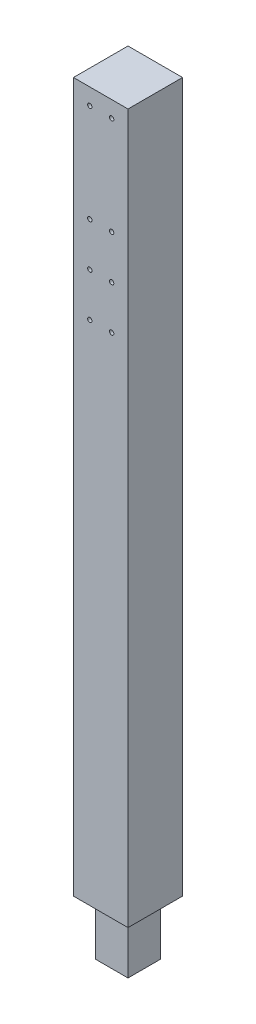
ISO-10303-21;
HEADER;
FILE_DESCRIPTION(('STEP AP214'),'2;1');
FILE_NAME('part.step','',(''),(''),'','','');
FILE_SCHEMA(('AUTOMOTIVE_DESIGN { 1 0 10303 214 1 1 1 1 }'));
ENDSEC;
DATA;
#1=APPLICATION_CONTEXT('core data for automotive mechanical design processes');
#2=APPLICATION_PROTOCOL_DEFINITION('international standard','automotive_design',2000,#1);
#3=PRODUCT_CONTEXT('',#1,'mechanical');
#4=PRODUCT('Part','Part','',(#3));
#5=PRODUCT_RELATED_PRODUCT_CATEGORY('part','',(#4));
#6=PRODUCT_DEFINITION_FORMATION('','',#4);
#7=PRODUCT_DEFINITION_CONTEXT('part definition',#1,'design');
#8=PRODUCT_DEFINITION('design','',#6,#7);
#9=PRODUCT_DEFINITION_SHAPE('','',#8);
#10=(LENGTH_UNIT() NAMED_UNIT(*) SI_UNIT(.MILLI.,.METRE.));
#11=(NAMED_UNIT(*) PLANE_ANGLE_UNIT() SI_UNIT($,.RADIAN.));
#12=(NAMED_UNIT(*) SI_UNIT($,.STERADIAN.) SOLID_ANGLE_UNIT());
#13=UNCERTAINTY_MEASURE_WITH_UNIT(LENGTH_MEASURE(1.E-05),#10,'distance_accuracy_value','');
#14=(GEOMETRIC_REPRESENTATION_CONTEXT(3) GLOBAL_UNCERTAINTY_ASSIGNED_CONTEXT((#13)) GLOBAL_UNIT_ASSIGNED_CONTEXT((#10,
#11,#12)) REPRESENTATION_CONTEXT('',''));
#15=CARTESIAN_POINT('',(0.,0.,0.));
#16=DIRECTION('',(0.,0.,1.));
#17=DIRECTION('',(1.,0.,0.));
#18=AXIS2_PLACEMENT_3D('',#15,#16,#17);
#19=CARTESIAN_POINT('',(0.,0.,0.));
#20=DIRECTION('',(0.,-1.,0.));
#21=DIRECTION('',(0.,0.,-1.));
#22=AXIS2_PLACEMENT_3D('',#19,#20,#21);
#23=PLANE('',#22);
#24=DIRECTION('',(-1.,0.,0.));
#25=VECTOR('',#24,1.);
#26=CARTESIAN_POINT('',(25.,0.,-20.));
#27=LINE('',#26,#25);
#28=CARTESIAN_POINT('',(20.,0.,-20.));
#29=VERTEX_POINT('',#28);
#30=CARTESIAN_POINT('',(5.,0.,-20.));
#31=VERTEX_POINT('',#30);
#32=EDGE_CURVE('E116',#29,#31,#27,.T.);
#33=ORIENTED_EDGE('',*,*,#32,.F.);
#34=DIRECTION('',(0.,0.,-1.));
#35=VECTOR('',#34,1.);
#36=CARTESIAN_POINT('',(20.,0.,0.));
#37=LINE('',#36,#35);
#38=CARTESIAN_POINT('',(20.,0.,-5.));
#39=VERTEX_POINT('',#38);
#40=EDGE_CURVE('E101',#39,#29,#37,.T.);
#41=ORIENTED_EDGE('',*,*,#40,.F.);
#42=DIRECTION('',(-1.,0.,0.));
#43=VECTOR('',#42,1.);
#44=CARTESIAN_POINT('',(25.,0.,-5.00000000000002));
#45=LINE('',#44,#43);
#46=CARTESIAN_POINT('',(5.,0.,-5.00000000000002));
#47=VERTEX_POINT('',#46);
#48=EDGE_CURVE('E136',#39,#47,#45,.T.);
#49=ORIENTED_EDGE('',*,*,#48,.T.);
#50=DIRECTION('',(0.,0.,-1.));
#51=VECTOR('',#50,1.);
#52=CARTESIAN_POINT('',(5.,0.,0.));
#53=LINE('',#52,#51);
#54=EDGE_CURVE('E119',#47,#31,#53,.T.);
#55=ORIENTED_EDGE('',*,*,#54,.T.);
#56=EDGE_LOOP('',(#33,#41,#49,#55));
#57=FACE_BOUND('',#56,.T.);
#58=ADVANCED_FACE('F38',(#57),#23,.T.);
#59=CARTESIAN_POINT('',(25.,0.,-5.));
#60=DIRECTION('',(0.,0.,-1.));
#61=DIRECTION('',(0.,1.,0.));
#62=AXIS2_PLACEMENT_3D('',#59,#60,#61);
#63=PLANE('',#62);
#64=DIRECTION('',(0.,-1.,0.));
#65=VECTOR('',#64,1.);
#66=CARTESIAN_POINT('',(20.,0.,-5.));
#67=LINE('',#66,#65);
#68=CARTESIAN_POINT('',(20.,25.,-5.00000000000004));
#69=VERTEX_POINT('',#68);
#70=EDGE_CURVE('E104',#69,#39,#67,.T.);
#71=ORIENTED_EDGE('',*,*,#70,.F.);
#72=DIRECTION('',(-1.,0.,0.));
#73=VECTOR('',#72,1.);
#74=CARTESIAN_POINT('',(25.,25.,-5.00000000000004));
#75=LINE('',#74,#73);
#76=CARTESIAN_POINT('',(5.,25.,-5.00000000000002));
#77=VERTEX_POINT('',#76);
#78=EDGE_CURVE('E138',#69,#77,#75,.T.);
#79=ORIENTED_EDGE('',*,*,#78,.T.);
#80=DIRECTION('',(0.,-1.,0.));
#81=VECTOR('',#80,1.);
#82=CARTESIAN_POINT('',(5.,0.,-5.));
#83=LINE('',#82,#81);
#84=EDGE_CURVE('E109',#77,#47,#83,.T.);
#85=ORIENTED_EDGE('',*,*,#84,.T.);
#86=ORIENTED_EDGE('',*,*,#48,.F.);
#87=EDGE_LOOP('',(#71,#79,#85,#86));
#88=FACE_BOUND('',#87,.T.);
#89=ADVANCED_FACE('F239',(#88),#63,.F.);
#90=CARTESIAN_POINT('',(25.,0.,-20.));
#91=DIRECTION('',(0.,0.,-1.));
#92=DIRECTION('',(0.,1.,0.));
#93=AXIS2_PLACEMENT_3D('',#90,#91,#92);
#94=PLANE('',#93);
#95=DIRECTION('',(-1.,0.,0.));
#96=VECTOR('',#95,1.);
#97=CARTESIAN_POINT('',(25.,25.,-20.));
#98=LINE('',#97,#96);
#99=CARTESIAN_POINT('',(20.,25.,-20.));
#100=VERTEX_POINT('',#99);
#101=CARTESIAN_POINT('',(5.,25.,-20.));
#102=VERTEX_POINT('',#101);
#103=EDGE_CURVE('E118',#100,#102,#98,.T.);
#104=ORIENTED_EDGE('',*,*,#103,.F.);
#105=DIRECTION('',(0.,-1.,0.));
#106=VECTOR('',#105,1.);
#107=CARTESIAN_POINT('',(20.,0.,-20.));
#108=LINE('',#107,#106);
#109=EDGE_CURVE('E61',#100,#29,#108,.T.);
#110=ORIENTED_EDGE('',*,*,#109,.T.);
#111=ORIENTED_EDGE('',*,*,#32,.T.);
#112=DIRECTION('',(0.,-1.,0.));
#113=VECTOR('',#112,1.);
#114=CARTESIAN_POINT('',(5.,0.,-20.));
#115=LINE('',#114,#113);
#116=EDGE_CURVE('E397',#102,#31,#115,.T.);
#117=ORIENTED_EDGE('',*,*,#116,.F.);
#118=EDGE_LOOP('',(#104,#110,#111,#117));
#119=FACE_BOUND('',#118,.T.);
#120=ADVANCED_FACE('F115',(#119),#94,.T.);
#121=CARTESIAN_POINT('',(0.,350.,-25.));
#122=DIRECTION('',(0.,0.,1.));
#123=DIRECTION('',(1.,0.,0.));
#124=AXIS2_PLACEMENT_3D('',#121,#122,#123);
#125=PLANE('',#124);
#126=CARTESIAN_POINT('',(17.5,297.5,-25.));
#127=DIRECTION('',(0.,0.,-1.));
#128=DIRECTION('',(-1.,0.,0.));
#129=AXIS2_PLACEMENT_3D('',#126,#127,#128);
#130=CIRCLE('',#129,1.00000000000001);
#131=CARTESIAN_POINT('',(16.5,297.5,-25.));
#132=VERTEX_POINT('',#131);
#133=EDGE_CURVE('E163',#132,#132,#130,.T.);
#134=ORIENTED_EDGE('',*,*,#133,.F.);
#135=EDGE_LOOP('',(#134));
#136=FACE_BOUND('',#135,.T.);
#137=CARTESIAN_POINT('',(17.5,342.5,-25.));
#138=DIRECTION('',(0.,0.,-1.));
#139=DIRECTION('',(-1.,0.,0.));
#140=AXIS2_PLACEMENT_3D('',#137,#138,#139);
#141=CIRCLE('',#140,1.);
#142=CARTESIAN_POINT('',(16.5,342.5,-25.));
#143=VERTEX_POINT('',#142);
#144=EDGE_CURVE('E175',#143,#143,#141,.T.);
#145=ORIENTED_EDGE('',*,*,#144,.F.);
#146=EDGE_LOOP('',(#145));
#147=FACE_BOUND('',#146,.T.);
#148=CARTESIAN_POINT('',(17.5,277.5,-25.));
#149=DIRECTION('',(0.,0.,-1.));
#150=DIRECTION('',(-1.,0.,0.));
#151=AXIS2_PLACEMENT_3D('',#148,#149,#150);
#152=CIRCLE('',#151,1.);
#153=CARTESIAN_POINT('',(16.5,277.5,-25.));
#154=VERTEX_POINT('',#153);
#155=EDGE_CURVE('E145',#154,#154,#152,.T.);
#156=ORIENTED_EDGE('',*,*,#155,.F.);
#157=EDGE_LOOP('',(#156));
#158=FACE_BOUND('',#157,.T.);
#159=CARTESIAN_POINT('',(17.5,257.5,-25.));
#160=DIRECTION('',(0.,0.,-1.));
#161=DIRECTION('',(-1.,0.,0.));
#162=AXIS2_PLACEMENT_3D('',#159,#160,#161);
#163=CIRCLE('',#162,1.);
#164=CARTESIAN_POINT('',(16.5,257.5,-25.));
#165=VERTEX_POINT('',#164);
#166=EDGE_CURVE('E151',#165,#165,#163,.T.);
#167=ORIENTED_EDGE('',*,*,#166,.F.);
#168=EDGE_LOOP('',(#167));
#169=FACE_BOUND('',#168,.T.);
#170=CARTESIAN_POINT('',(7.5,342.5,-25.));
#171=DIRECTION('',(0.,0.,1.));
#172=DIRECTION('',(1.,0.,0.));
#173=AXIS2_PLACEMENT_3D('',#170,#171,#172);
#174=CIRCLE('',#173,1.);
#175=CARTESIAN_POINT('',(8.5,342.5,-25.));
#176=VERTEX_POINT('',#175);
#177=EDGE_CURVE('E183',#176,#176,#174,.T.);
#178=ORIENTED_EDGE('',*,*,#177,.T.);
#179=EDGE_LOOP('',(#178));
#180=FACE_BOUND('',#179,.T.);
#181=CARTESIAN_POINT('',(7.50000000000001,257.5,-25.));
#182=DIRECTION('',(0.,0.,1.));
#183=DIRECTION('',(1.,0.,0.));
#184=AXIS2_PLACEMENT_3D('',#181,#182,#183);
#185=CIRCLE('',#184,1.);
#186=CARTESIAN_POINT('',(8.50000000000001,257.5,-25.));
#187=VERTEX_POINT('',#186);
#188=EDGE_CURVE('E125',#187,#187,#185,.T.);
#189=ORIENTED_EDGE('',*,*,#188,.T.);
#190=EDGE_LOOP('',(#189));
#191=FACE_BOUND('',#190,.T.);
#192=CARTESIAN_POINT('',(7.50000000000001,297.5,-25.));
#193=DIRECTION('',(0.,0.,1.));
#194=DIRECTION('',(1.,0.,0.));
#195=AXIS2_PLACEMENT_3D('',#192,#193,#194);
#196=CIRCLE('',#195,1.);
#197=CARTESIAN_POINT('',(8.50000000000001,297.5,-25.));
#198=VERTEX_POINT('',#197);
#199=EDGE_CURVE('E162',#198,#198,#196,.T.);
#200=ORIENTED_EDGE('',*,*,#199,.T.);
#201=EDGE_LOOP('',(#200));
#202=FACE_BOUND('',#201,.T.);
#203=CARTESIAN_POINT('',(7.50000000000001,277.5,-25.));
#204=DIRECTION('',(0.,0.,1.));
#205=DIRECTION('',(1.,0.,0.));
#206=AXIS2_PLACEMENT_3D('',#203,#204,#205);
#207=CIRCLE('',#206,1.);
#208=CARTESIAN_POINT('',(8.50000000000001,277.5,-25.));
#209=VERTEX_POINT('',#208);
#210=EDGE_CURVE('E144',#209,#209,#207,.T.);
#211=ORIENTED_EDGE('',*,*,#210,.T.);
#212=EDGE_LOOP('',(#211));
#213=FACE_BOUND('',#212,.T.);
#214=DIRECTION('',(-1.,0.,0.));
#215=VECTOR('',#214,1.);
#216=CARTESIAN_POINT('',(25.,25.,-25.));
#217=LINE('',#216,#215);
#218=CARTESIAN_POINT('',(25.,25.,-25.));
#219=VERTEX_POINT('',#218);
#220=CARTESIAN_POINT('',(0.,25.,-25.));
#221=VERTEX_POINT('',#220);
#222=EDGE_CURVE('E123',#219,#221,#217,.T.);
#223=ORIENTED_EDGE('',*,*,#222,.T.);
#224=DIRECTION('',(0.,-1.,0.));
#225=VECTOR('',#224,1.);
#226=CARTESIAN_POINT('',(0.,350.,-25.));
#227=LINE('',#226,#225);
#228=CARTESIAN_POINT('',(0.,350.,-25.));
#229=VERTEX_POINT('',#228);
#230=EDGE_CURVE('E197',#229,#221,#227,.T.);
#231=ORIENTED_EDGE('',*,*,#230,.F.);
#232=DIRECTION('',(-1.,0.,0.));
#233=VECTOR('',#232,1.);
#234=CARTESIAN_POINT('',(0.,350.,-25.));
#235=LINE('',#234,#233);
#236=CARTESIAN_POINT('',(25.,350.,-25.));
#237=VERTEX_POINT('',#236);
#238=EDGE_CURVE('E195',#237,#229,#235,.T.);
#239=ORIENTED_EDGE('',*,*,#238,.F.);
#240=DIRECTION('',(0.,-1.,0.));
#241=VECTOR('',#240,1.);
#242=CARTESIAN_POINT('',(25.,350.,-25.));
#243=LINE('',#242,#241);
#244=EDGE_CURVE('E200',#237,#219,#243,.T.);
#245=ORIENTED_EDGE('',*,*,#244,.T.);
#246=EDGE_LOOP('',(#223,#231,#239,#245));
#247=FACE_BOUND('',#246,.T.);
#248=ADVANCED_FACE('F222',(#136,#147,#158,#169,#180,#191,#202,#213,#247),#125,.F.);
#249=CARTESIAN_POINT('',(0.,350.,0.));
#250=DIRECTION('',(1.,0.,0.));
#251=DIRECTION('',(0.,0.,-1.));
#252=AXIS2_PLACEMENT_3D('',#249,#250,#251);
#253=PLANE('',#252);
#254=DIRECTION('',(0.,0.,-1.));
#255=VECTOR('',#254,1.);
#256=CARTESIAN_POINT('',(0.,25.,0.));
#257=LINE('',#256,#255);
#258=CARTESIAN_POINT('',(0.,25.,0.));
#259=VERTEX_POINT('',#258);
#260=EDGE_CURVE('E122',#259,#221,#257,.T.);
#261=ORIENTED_EDGE('',*,*,#260,.F.);
#262=DIRECTION('',(0.,-1.,0.));
#263=VECTOR('',#262,1.);
#264=CARTESIAN_POINT('',(0.,350.,0.));
#265=LINE('',#264,#263);
#266=CARTESIAN_POINT('',(0.,350.,0.));
#267=VERTEX_POINT('',#266);
#268=EDGE_CURVE('E12',#267,#259,#265,.T.);
#269=ORIENTED_EDGE('',*,*,#268,.F.);
#270=DIRECTION('',(0.,0.,1.));
#271=VECTOR('',#270,1.);
#272=CARTESIAN_POINT('',(0.,350.,0.));
#273=LINE('',#272,#271);
#274=EDGE_CURVE('E186',#229,#267,#273,.T.);
#275=ORIENTED_EDGE('',*,*,#274,.F.);
#276=ORIENTED_EDGE('',*,*,#230,.T.);
#277=EDGE_LOOP('',(#261,#269,#275,#276));
#278=FACE_BOUND('',#277,.T.);
#279=ADVANCED_FACE('F40',(#278),#253,.F.);
#280=CARTESIAN_POINT('',(25.,350.,0.));
#281=DIRECTION('',(-1.,0.,0.));
#282=DIRECTION('',(0.,0.,1.));
#283=AXIS2_PLACEMENT_3D('',#280,#281,#282);
#284=PLANE('',#283);
#285=DIRECTION('',(0.,-1.,0.));
#286=VECTOR('',#285,1.);
#287=CARTESIAN_POINT('',(25.,350.,0.));
#288=LINE('',#287,#286);
#289=CARTESIAN_POINT('',(25.,350.,0.));
#290=VERTEX_POINT('',#289);
#291=CARTESIAN_POINT('',(25.,25.,0.));
#292=VERTEX_POINT('',#291);
#293=EDGE_CURVE('E46',#290,#292,#288,.T.);
#294=ORIENTED_EDGE('',*,*,#293,.T.);
#295=DIRECTION('',(0.,0.,1.));
#296=VECTOR('',#295,1.);
#297=CARTESIAN_POINT('',(25.,25.,0.));
#298=LINE('',#297,#296);
#299=EDGE_CURVE('E130',#219,#292,#298,.T.);
#300=ORIENTED_EDGE('',*,*,#299,.F.);
#301=ORIENTED_EDGE('',*,*,#244,.F.);
#302=DIRECTION('',(0.,0.,-1.));
#303=VECTOR('',#302,1.);
#304=CARTESIAN_POINT('',(25.,350.,0.));
#305=LINE('',#304,#303);
#306=EDGE_CURVE('E193',#290,#237,#305,.T.);
#307=ORIENTED_EDGE('',*,*,#306,.F.);
#308=EDGE_LOOP('',(#294,#300,#301,#307));
#309=FACE_BOUND('',#308,.T.);
#310=ADVANCED_FACE('F207',(#309),#284,.F.);
#311=CARTESIAN_POINT('',(0.,350.,0.));
#312=DIRECTION('',(0.,0.,-1.));
#313=DIRECTION('',(-1.,0.,0.));
#314=AXIS2_PLACEMENT_3D('',#311,#312,#313);
#315=PLANE('',#314);
#316=CARTESIAN_POINT('',(7.50000000000001,277.5,0.));
#317=DIRECTION('',(0.,0.,1.));
#318=DIRECTION('',(1.,0.,0.));
#319=AXIS2_PLACEMENT_3D('',#316,#317,#318);
#320=CIRCLE('',#319,1.);
#321=CARTESIAN_POINT('',(8.50000000000001,277.5,0.));
#322=VERTEX_POINT('',#321);
#323=EDGE_CURVE('E166',#322,#322,#320,.T.);
#324=ORIENTED_EDGE('',*,*,#323,.F.);
#325=EDGE_LOOP('',(#324));
#326=FACE_BOUND('',#325,.T.);
#327=CARTESIAN_POINT('',(7.50000000000001,297.5,0.));
#328=DIRECTION('',(0.,0.,1.));
#329=DIRECTION('',(1.,0.,0.));
#330=AXIS2_PLACEMENT_3D('',#327,#328,#329);
#331=CIRCLE('',#330,1.);
#332=CARTESIAN_POINT('',(8.50000000000001,297.5,0.));
#333=VERTEX_POINT('',#332);
#334=EDGE_CURVE('E178',#333,#333,#331,.T.);
#335=ORIENTED_EDGE('',*,*,#334,.F.);
#336=EDGE_LOOP('',(#335));
#337=FACE_BOUND('',#336,.T.);
#338=CARTESIAN_POINT('',(7.50000000000001,257.5,0.));
#339=DIRECTION('',(0.,0.,1.));
#340=DIRECTION('',(1.,0.,0.));
#341=AXIS2_PLACEMENT_3D('',#338,#339,#340);
#342=CIRCLE('',#341,1.);
#343=CARTESIAN_POINT('',(8.50000000000001,257.5,0.));
#344=VERTEX_POINT('',#343);
#345=EDGE_CURVE('E154',#344,#344,#342,.T.);
#346=ORIENTED_EDGE('',*,*,#345,.F.);
#347=EDGE_LOOP('',(#346));
#348=FACE_BOUND('',#347,.T.);
#349=CARTESIAN_POINT('',(7.5,342.5,0.));
#350=DIRECTION('',(0.,0.,1.));
#351=DIRECTION('',(1.,0.,0.));
#352=AXIS2_PLACEMENT_3D('',#349,#350,#351);
#353=CIRCLE('',#352,1.);
#354=CARTESIAN_POINT('',(8.5,342.5,0.));
#355=VERTEX_POINT('',#354);
#356=EDGE_CURVE('E174',#355,#355,#353,.T.);
#357=ORIENTED_EDGE('',*,*,#356,.F.);
#358=EDGE_LOOP('',(#357));
#359=FACE_BOUND('',#358,.T.);
#360=ORIENTED_EDGE('',*,*,#268,.T.);
#361=DIRECTION('',(-1.,0.,0.));
#362=VECTOR('',#361,1.);
#363=CARTESIAN_POINT('',(25.,25.,0.));
#364=LINE('',#363,#362);
#365=EDGE_CURVE('E134',#292,#259,#364,.T.);
#366=ORIENTED_EDGE('',*,*,#365,.F.);
#367=ORIENTED_EDGE('',*,*,#293,.F.);
#368=DIRECTION('',(1.,0.,0.));
#369=VECTOR('',#368,1.);
#370=CARTESIAN_POINT('',(0.,350.,0.));
#371=LINE('',#370,#369);
#372=EDGE_CURVE('E191',#267,#290,#371,.T.);
#373=ORIENTED_EDGE('',*,*,#372,.F.);
#374=EDGE_LOOP('',(#360,#366,#367,#373));
#375=FACE_BOUND('',#374,.T.);
#376=CARTESIAN_POINT('',(17.5,257.5,0.));
#377=DIRECTION('',(0.,0.,-1.));
#378=DIRECTION('',(-1.,0.,0.));
#379=AXIS2_PLACEMENT_3D('',#376,#377,#378);
#380=CIRCLE('',#379,1.);
#381=CARTESIAN_POINT('',(16.5,257.5,0.));
#382=VERTEX_POINT('',#381);
#383=EDGE_CURVE('E148',#382,#382,#380,.T.);
#384=ORIENTED_EDGE('',*,*,#383,.T.);
#385=EDGE_LOOP('',(#384));
#386=FACE_BOUND('',#385,.T.);
#387=CARTESIAN_POINT('',(17.5,277.5,0.));
#388=DIRECTION('',(0.,0.,-1.));
#389=DIRECTION('',(-1.,0.,0.));
#390=AXIS2_PLACEMENT_3D('',#387,#388,#389);
#391=CIRCLE('',#390,1.);
#392=CARTESIAN_POINT('',(16.5,277.5,0.));
#393=VERTEX_POINT('',#392);
#394=EDGE_CURVE('E141',#393,#393,#391,.T.);
#395=ORIENTED_EDGE('',*,*,#394,.T.);
#396=EDGE_LOOP('',(#395));
#397=FACE_BOUND('',#396,.T.);
#398=CARTESIAN_POINT('',(17.5,342.5,0.));
#399=DIRECTION('',(0.,0.,-1.));
#400=DIRECTION('',(-1.,0.,0.));
#401=AXIS2_PLACEMENT_3D('',#398,#399,#400);
#402=CIRCLE('',#401,1.);
#403=CARTESIAN_POINT('',(16.5,342.5,0.));
#404=VERTEX_POINT('',#403);
#405=EDGE_CURVE('E171',#404,#404,#402,.T.);
#406=ORIENTED_EDGE('',*,*,#405,.T.);
#407=EDGE_LOOP('',(#406));
#408=FACE_BOUND('',#407,.T.);
#409=CARTESIAN_POINT('',(17.5,297.5,0.));
#410=DIRECTION('',(0.,0.,-1.));
#411=DIRECTION('',(-1.,0.,0.));
#412=AXIS2_PLACEMENT_3D('',#409,#410,#411);
#413=CIRCLE('',#412,1.00000000000001);
#414=CARTESIAN_POINT('',(16.5,297.5,0.));
#415=VERTEX_POINT('',#414);
#416=EDGE_CURVE('E159',#415,#415,#413,.T.);
#417=ORIENTED_EDGE('',*,*,#416,.T.);
#418=EDGE_LOOP('',(#417));
#419=FACE_BOUND('',#418,.T.);
#420=ADVANCED_FACE('F211',(#326,#337,#348,#359,#375,#386,#397,#408,#419),#315,.F.);
#421=CARTESIAN_POINT('',(0.,350.,0.));
#422=DIRECTION('',(0.,-1.,0.));
#423=DIRECTION('',(0.,0.,-1.));
#424=AXIS2_PLACEMENT_3D('',#421,#422,#423);
#425=PLANE('',#424);
#426=ORIENTED_EDGE('',*,*,#274,.T.);
#427=ORIENTED_EDGE('',*,*,#372,.T.);
#428=ORIENTED_EDGE('',*,*,#306,.T.);
#429=ORIENTED_EDGE('',*,*,#238,.T.);
#430=EDGE_LOOP('',(#426,#427,#428,#429));
#431=FACE_BOUND('',#430,.T.);
#432=ADVANCED_FACE('F224',(#431),#425,.F.);
#433=CARTESIAN_POINT('',(7.5,342.5,-25.));
#434=DIRECTION('',(0.,0.,1.));
#435=DIRECTION('',(1.,0.,0.));
#436=AXIS2_PLACEMENT_3D('',#433,#434,#435);
#437=CYLINDRICAL_SURFACE('',#436,1.);
#438=ORIENTED_EDGE('',*,*,#177,.F.);
#439=EDGE_LOOP('',(#438));
#440=FACE_BOUND('',#439,.T.);
#441=ORIENTED_EDGE('',*,*,#356,.T.);
#442=EDGE_LOOP('',(#441));
#443=FACE_BOUND('',#442,.T.);
#444=ADVANCED_FACE('F226',(#440,#443),#437,.F.);
#445=CARTESIAN_POINT('',(7.50000000000001,257.5,-25.));
#446=DIRECTION('',(0.,0.,1.));
#447=DIRECTION('',(1.,0.,0.));
#448=AXIS2_PLACEMENT_3D('',#445,#446,#447);
#449=CYLINDRICAL_SURFACE('',#448,1.);
#450=ORIENTED_EDGE('',*,*,#188,.F.);
#451=EDGE_LOOP('',(#450));
#452=FACE_BOUND('',#451,.T.);
#453=ORIENTED_EDGE('',*,*,#345,.T.);
#454=EDGE_LOOP('',(#453));
#455=FACE_BOUND('',#454,.T.);
#456=ADVANCED_FACE('F232',(#452,#455),#449,.F.);
#457=CARTESIAN_POINT('',(17.5,257.5,-25.));
#458=DIRECTION('',(0.,0.,1.));
#459=DIRECTION('',(1.,0.,0.));
#460=AXIS2_PLACEMENT_3D('',#457,#458,#459);
#461=CYLINDRICAL_SURFACE('',#460,1.);
#462=ORIENTED_EDGE('',*,*,#166,.T.);
#463=EDGE_LOOP('',(#462));
#464=FACE_BOUND('',#463,.T.);
#465=ORIENTED_EDGE('',*,*,#383,.F.);
#466=EDGE_LOOP('',(#465));
#467=FACE_BOUND('',#466,.T.);
#468=ADVANCED_FACE('F326',(#464,#467),#461,.F.);
#469=CARTESIAN_POINT('',(17.5,277.5,-25.));
#470=DIRECTION('',(0.,0.,1.));
#471=DIRECTION('',(1.,0.,0.));
#472=AXIS2_PLACEMENT_3D('',#469,#470,#471);
#473=CYLINDRICAL_SURFACE('',#472,1.);
#474=ORIENTED_EDGE('',*,*,#155,.T.);
#475=EDGE_LOOP('',(#474));
#476=FACE_BOUND('',#475,.T.);
#477=ORIENTED_EDGE('',*,*,#394,.F.);
#478=EDGE_LOOP('',(#477));
#479=FACE_BOUND('',#478,.T.);
#480=ADVANCED_FACE('F318',(#476,#479),#473,.F.);
#481=CARTESIAN_POINT('',(17.5,342.5,-25.));
#482=DIRECTION('',(0.,0.,1.));
#483=DIRECTION('',(1.,0.,0.));
#484=AXIS2_PLACEMENT_3D('',#481,#482,#483);
#485=CYLINDRICAL_SURFACE('',#484,1.);
#486=ORIENTED_EDGE('',*,*,#144,.T.);
#487=EDGE_LOOP('',(#486));
#488=FACE_BOUND('',#487,.T.);
#489=ORIENTED_EDGE('',*,*,#405,.F.);
#490=EDGE_LOOP('',(#489));
#491=FACE_BOUND('',#490,.T.);
#492=ADVANCED_FACE('F310',(#488,#491),#485,.F.);
#493=CARTESIAN_POINT('',(7.50000000000001,297.5,-25.));
#494=DIRECTION('',(0.,0.,1.));
#495=DIRECTION('',(1.,0.,0.));
#496=AXIS2_PLACEMENT_3D('',#493,#494,#495);
#497=CYLINDRICAL_SURFACE('',#496,1.);
#498=ORIENTED_EDGE('',*,*,#199,.F.);
#499=EDGE_LOOP('',(#498));
#500=FACE_BOUND('',#499,.T.);
#501=ORIENTED_EDGE('',*,*,#334,.T.);
#502=EDGE_LOOP('',(#501));
#503=FACE_BOUND('',#502,.T.);
#504=ADVANCED_FACE('F302',(#500,#503),#497,.F.);
#505=CARTESIAN_POINT('',(17.5,297.5,-25.));
#506=DIRECTION('',(0.,0.,1.));
#507=DIRECTION('',(1.,0.,0.));
#508=AXIS2_PLACEMENT_3D('',#505,#506,#507);
#509=CYLINDRICAL_SURFACE('',#508,1.00000000000001);
#510=ORIENTED_EDGE('',*,*,#133,.T.);
#511=EDGE_LOOP('',(#510));
#512=FACE_BOUND('',#511,.T.);
#513=ORIENTED_EDGE('',*,*,#416,.F.);
#514=EDGE_LOOP('',(#513));
#515=FACE_BOUND('',#514,.T.);
#516=ADVANCED_FACE('F295',(#512,#515),#509,.F.);
#517=CARTESIAN_POINT('',(7.50000000000001,277.5,-25.));
#518=DIRECTION('',(0.,0.,1.));
#519=DIRECTION('',(1.,0.,0.));
#520=AXIS2_PLACEMENT_3D('',#517,#518,#519);
#521=CYLINDRICAL_SURFACE('',#520,1.);
#522=ORIENTED_EDGE('',*,*,#210,.F.);
#523=EDGE_LOOP('',(#522));
#524=FACE_BOUND('',#523,.T.);
#525=ORIENTED_EDGE('',*,*,#323,.T.);
#526=EDGE_LOOP('',(#525));
#527=FACE_BOUND('',#526,.T.);
#528=ADVANCED_FACE('F291',(#524,#527),#521,.F.);
#529=CARTESIAN_POINT('',(25.,25.,0.));
#530=DIRECTION('',(0.,-1.,0.));
#531=DIRECTION('',(0.,0.,-1.));
#532=AXIS2_PLACEMENT_3D('',#529,#530,#531);
#533=PLANE('',#532);
#534=ORIENTED_EDGE('',*,*,#78,.F.);
#535=DIRECTION('',(0.,0.,-1.));
#536=VECTOR('',#535,1.);
#537=CARTESIAN_POINT('',(20.,25.,0.));
#538=LINE('',#537,#536);
#539=EDGE_CURVE('E110',#69,#100,#538,.T.);
#540=ORIENTED_EDGE('',*,*,#539,.T.);
#541=ORIENTED_EDGE('',*,*,#103,.T.);
#542=DIRECTION('',(0.,0.,-1.));
#543=VECTOR('',#542,1.);
#544=CARTESIAN_POINT('',(5.,25.,0.));
#545=LINE('',#544,#543);
#546=EDGE_CURVE('E53',#77,#102,#545,.T.);
#547=ORIENTED_EDGE('',*,*,#546,.F.);
#548=EDGE_LOOP('',(#534,#540,#541,#547));
#549=FACE_BOUND('',#548,.T.);
#550=ORIENTED_EDGE('',*,*,#260,.T.);
#551=ORIENTED_EDGE('',*,*,#222,.F.);
#552=ORIENTED_EDGE('',*,*,#299,.T.);
#553=ORIENTED_EDGE('',*,*,#365,.T.);
#554=EDGE_LOOP('',(#550,#551,#552,#553));
#555=FACE_BOUND('',#554,.T.);
#556=ADVANCED_FACE('F216',(#549,#555),#533,.T.);
#557=CARTESIAN_POINT('',(5.,0.,0.));
#558=DIRECTION('',(1.,0.,0.));
#559=DIRECTION('',(0.,1.,0.));
#560=AXIS2_PLACEMENT_3D('',#557,#558,#559);
#561=PLANE('',#560);
#562=ORIENTED_EDGE('',*,*,#546,.T.);
#563=ORIENTED_EDGE('',*,*,#116,.T.);
#564=ORIENTED_EDGE('',*,*,#54,.F.);
#565=ORIENTED_EDGE('',*,*,#84,.F.);
#566=EDGE_LOOP('',(#562,#563,#564,#565));
#567=FACE_BOUND('',#566,.T.);
#568=ADVANCED_FACE('F358',(#567),#561,.F.);
#569=CARTESIAN_POINT('',(20.,0.,0.));
#570=DIRECTION('',(1.,0.,0.));
#571=DIRECTION('',(0.,1.,0.));
#572=AXIS2_PLACEMENT_3D('',#569,#570,#571);
#573=PLANE('',#572);
#574=ORIENTED_EDGE('',*,*,#70,.T.);
#575=ORIENTED_EDGE('',*,*,#40,.T.);
#576=ORIENTED_EDGE('',*,*,#109,.F.);
#577=ORIENTED_EDGE('',*,*,#539,.F.);
#578=EDGE_LOOP('',(#574,#575,#576,#577));
#579=FACE_BOUND('',#578,.T.);
#580=ADVANCED_FACE('F102',(#579),#573,.T.);
#581=CLOSED_SHELL('',(#58,#89,#120,#248,#279,#310,#420,#432,#444,#456,#468,#480,#492,#504,#516,
#528,#556,#568,#580));
#582=MANIFOLD_SOLID_BREP('B2',#581);
#583=ADVANCED_BREP_SHAPE_REPRESENTATION('',(#18,#582),#14);
#584=SHAPE_DEFINITION_REPRESENTATION(#9,#583);
ENDSEC;
END-ISO-10303-21;
